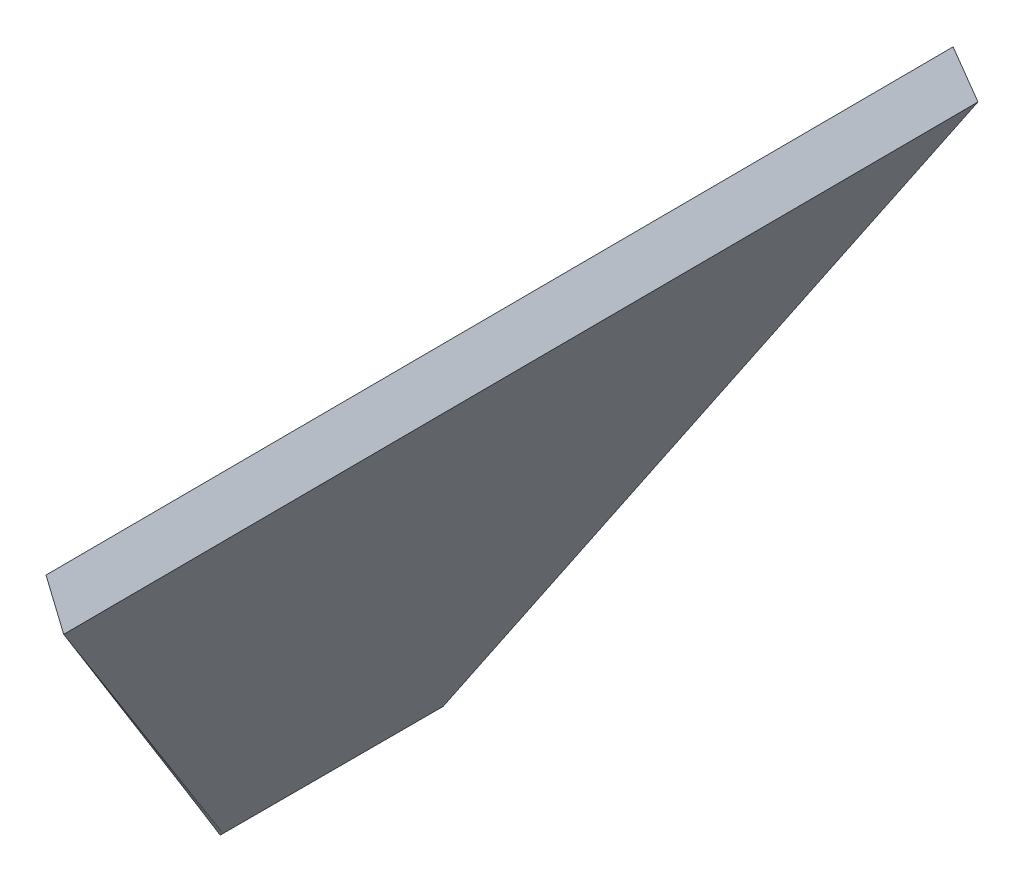
ISO-10303-21;
HEADER;
FILE_DESCRIPTION(('STEP AP214'),'2;1');
FILE_NAME('part.step','',(''),(''),'','','');
FILE_SCHEMA(('AUTOMOTIVE_DESIGN { 1 0 10303 214 1 1 1 1 }'));
ENDSEC;
DATA;
#1=APPLICATION_CONTEXT('core data for automotive mechanical design processes');
#2=APPLICATION_PROTOCOL_DEFINITION('international standard','automotive_design',2000,#1);
#3=PRODUCT_CONTEXT('',#1,'mechanical');
#4=PRODUCT('Part','Part','',(#3));
#5=PRODUCT_RELATED_PRODUCT_CATEGORY('part','',(#4));
#6=PRODUCT_DEFINITION_FORMATION('','',#4);
#7=PRODUCT_DEFINITION_CONTEXT('part definition',#1,'design');
#8=PRODUCT_DEFINITION('design','',#6,#7);
#9=PRODUCT_DEFINITION_SHAPE('','',#8);
#10=(LENGTH_UNIT() NAMED_UNIT(*) SI_UNIT(.MILLI.,.METRE.));
#11=(NAMED_UNIT(*) PLANE_ANGLE_UNIT() SI_UNIT($,.RADIAN.));
#12=(NAMED_UNIT(*) SI_UNIT($,.STERADIAN.) SOLID_ANGLE_UNIT());
#13=UNCERTAINTY_MEASURE_WITH_UNIT(LENGTH_MEASURE(1.E-05),#10,'distance_accuracy_value','');
#14=(GEOMETRIC_REPRESENTATION_CONTEXT(3) GLOBAL_UNCERTAINTY_ASSIGNED_CONTEXT((#13)) GLOBAL_UNIT_ASSIGNED_CONTEXT((#10,
#11,#12)) REPRESENTATION_CONTEXT('',''));
#15=CARTESIAN_POINT('',(0.,0.,0.));
#16=DIRECTION('',(0.,0.,1.));
#17=DIRECTION('',(1.,0.,0.));
#18=AXIS2_PLACEMENT_3D('',#15,#16,#17);
#19=CARTESIAN_POINT('',(-108.724229990897,312.439251428831,147.462223686257));
#20=DIRECTION('',(0.573127406974514,0.259388760360691,-0.777330332852909));
#21=DIRECTION('',(-0.804878930909419,0.,-0.593439050432403));
#22=AXIS2_PLACEMENT_3D('',#19,#20,#21);
#23=PLANE('',#22);
#24=CARTESIAN_POINT('',(85.6116867373077,31.4461867373069,196.981450827299));
#25=CARTESIAN_POINT('',(87.0719563259686,33.2839078969792,198.671343374664));
#26=CARTESIAN_POINT('',(88.5328622001463,35.1209118043416,200.361465715558));
#27=CARTESIAN_POINT('',(91.4557288766099,38.7937293281955,203.742091007913));
#28=CARTESIAN_POINT('',(92.9176896787831,40.6295429448143,205.432593959333));
#29=CARTESIAN_POINT('',(95.8424479246026,44.3002232939045,208.813900752339));
#30=CARTESIAN_POINT('',(97.3052453677012,46.1350900269941,210.504704593727));
#31=CARTESIAN_POINT('',(100.231529953867,49.8040444140138,213.886560821516));
#32=CARTESIAN_POINT('',(101.695017096956,51.6381320679197,215.577613207924));
#33=CARTESIAN_POINT('',(106.086327611059,57.1394344198961,220.651075851717));
#34=CARTESIAN_POINT('',(109.015000421497,60.805688953096,224.033792003557));
#35=CARTESIAN_POINT('',(114.873943308968,68.1363861130635,230.799797357173));
#36=CARTESIAN_POINT('',(117.804213384927,71.8008287410458,234.183086558564));
#37=CARTESIAN_POINT('',(123.665933443328,79.1283792537208,240.95008951616));
#38=CARTESIAN_POINT('',(126.597383425934,82.7914871382284,244.333803272425));
#39=CARTESIAN_POINT('',(132.461176734369,90.1166914411079,251.101551930969));
#40=CARTESIAN_POINT('',(135.393520060239,93.778787859434,254.485586833263));
#41=CARTESIAN_POINT('',(142.725229729155,102.933039680212,262.945971698112));
#42=CARTESIAN_POINT('',(147.125026928383,108.424706945342,268.022476444479));
#43=CARTESIAN_POINT('',(155.925714692369,119.406801670366,278.175878365238));
#44=CARTESIAN_POINT('',(160.326605257069,124.897229130325,283.25277553961));
#45=CARTESIAN_POINT('',(169.129192061475,135.877172760273,293.406859824358));
#46=CARTESIAN_POINT('',(173.530888301345,141.366688930079,298.484046934794));
#47=CARTESIAN_POINT('',(182.334890353051,152.345030193871,308.638639988116));
#48=CARTESIAN_POINT('',(186.737196164897,157.833855287847,313.716045931005));
#49=CARTESIAN_POINT('',(199.94481175737,174.299536078751,328.948513397212));
#50=CARTESIAN_POINT('',(208.750820827786,185.275598697528,339.10382586479));
#51=CARTESIAN_POINT('',(226.364012025771,207.226391286425,359.414871003695));
#52=CARTESIAN_POINT('',(235.171194153233,218.201121256666,369.570603674985));
#53=CARTESIAN_POINT('',(252.839482716995,240.215871186473,389.943614266309));
#54=CARTESIAN_POINT('',(261.700593981795,251.255885667907,400.160893918399));
#55=CARTESIAN_POINT('',(279.423385778047,273.33526871244,420.595657406512));
#56=CARTESIAN_POINT('',(288.285066309499,284.374637275539,430.813141242535));
#57=CARTESIAN_POINT('',(306.008843937193,306.45290479309,451.248259344183));
#58=CARTESIAN_POINT('',(314.870941033495,317.491803747474,461.465893609829));
#59=CARTESIAN_POINT('',(332.595454301163,339.569239542511,481.901276561503));
#60=CARTESIAN_POINT('',(341.457870472527,350.607776383164,492.119025247529));
#61=CARTESIAN_POINT('',(350.320398097041,361.646186737307,502.336813900701));
#62=B_SPLINE_CURVE_WITH_KNOTS('',3,(#24,#25,#26,#27,#28,#29,#30,#31,#32,#33,#34,#35,#36,#37,#38,
#39,#40,#41,#42,#43,#44,#45,#46,#47,#48,#49,#50,#51,#52,#53,#54,#55,#56,#57,#58,#59,#60,#61),
.UNSPECIFIED.,.F.,.F.,(4,2,2,2,2,2,2,2,2,2,2,2,2,2,2,2,2,2,4),(0.,8.67687040202061,
17.3537398763873,26.0306036781871,34.7074677489004,52.061193786794,69.4149081754379,
86.7686249700844,104.122342550636,130.15285758564,156.183371252471,182.213890169113,
208.244409457484,260.305441334685,312.366468448103,364.741521109206,417.116573785885,
469.49163411692,521.86669437124),.UNSPECIFIED.);
#63=CARTESIAN_POINT('',(85.6116867373077,31.4461867373069,196.981450827299));
#64=VERTEX_POINT('',#63);
#65=CARTESIAN_POINT('',(350.320400258716,361.646186737307,502.336811715639));
#66=VERTEX_POINT('',#65);
#67=EDGE_CURVE('E119',#64,#66,#62,.T.);
#68=ORIENTED_EDGE('',*,*,#67,.T.);
#69=CARTESIAN_POINT('',(341.615486236194,368.575782280536,498.231011991137));
#70=CARTESIAN_POINT('',(341.978192959735,368.287051688035,498.40208710989));
#71=CARTESIAN_POINT('',(342.340899431723,367.998320780169,498.57316222972));
#72=CARTESIAN_POINT('',(343.066311872591,367.420858333712,498.915312471534));
#73=CARTESIAN_POINT('',(343.429017841472,367.13212679512,499.086387593518));
#74=CARTESIAN_POINT('',(344.154429276127,366.554663087212,499.428537839641));
#75=CARTESIAN_POINT('',(344.517134741901,366.265930917895,499.599612963779));
#76=CARTESIAN_POINT('',(345.242545170342,365.68846594854,499.941763214211));
#77=CARTESIAN_POINT('',(345.605250133009,365.399733148501,500.112838340504));
#78=CARTESIAN_POINT('',(346.330659555237,364.822266917704,500.454988595244));
#79=CARTESIAN_POINT('',(346.693364014798,364.533533486944,500.626063723691));
#80=CARTESIAN_POINT('',(347.418772430813,363.956065994708,500.96821398274));
#81=CARTESIAN_POINT('',(347.781476387268,363.66733193323,501.139289113342));
#82=CARTESIAN_POINT('',(348.506883797071,363.089863179559,501.4814393767));
#83=CARTESIAN_POINT('',(348.869587250419,362.801128487365,501.652514509456));
#84=CARTESIAN_POINT('',(349.594993654011,362.223658472262,501.994664777122));
#85=CARTESIAN_POINT('',(349.957696604253,361.934923149353,502.165739912033));
#86=CARTESIAN_POINT('',(350.320399302943,361.646187511089,502.33681504802));
#87=B_SPLINE_CURVE_WITH_KNOTS('',3,(#69,#70,#71,#72,#73,#74,#75,#76,#77,#78,#79,#80,#81,#82,#83,
#84,#85,#86),.UNSPECIFIED.,.F.,.F.,(4,2,2,2,2,2,2,2,4),(0.,1.4824621301843,2.96492426036164,
4.44738639053315,5.92984852069981,7.41231065086241,8.89477278102214,10.3772349111797,
11.8596970413365),.UNSPECIFIED.);
#88=CARTESIAN_POINT('',(341.615486236194,368.575782280536,498.231011991137));
#89=VERTEX_POINT('',#88);
#90=EDGE_CURVE('E73',#89,#66,#87,.T.);
#91=ORIENTED_EDGE('',*,*,#90,.F.);
#92=CARTESIAN_POINT('',(76.9404436719945,38.395805428448,192.907154556921));
#93=CARTESIAN_POINT('',(81.7929076252006,44.4503462488485,198.50523781314));
#94=CARTESIAN_POINT('',(86.6454764812833,50.5047681623346,204.103358736224));
#95=CARTESIAN_POINT('',(96.3507613501414,62.6134451825814,215.299653419316));
#96=CARTESIAN_POINT('',(101.203477362917,68.6677002893421,220.897827179325));
#97=CARTESIAN_POINT('',(115.76175216307,86.8303219106648,237.692393969966));
#98=CARTESIAN_POINT('',(125.467437715139,98.9385447298398,248.888832514518));
#99=CARTESIAN_POINT('',(144.878968164247,123.154809728265,271.281766810967));
#100=CARTESIAN_POINT('',(154.584813061285,135.262851907516,282.478262562862));
#101=CARTESIAN_POINT('',(173.996592613353,159.478834517388,304.871286292739));
#102=CARTESIAN_POINT('',(183.702527268382,171.586774948009,316.06781427072));
#103=CARTESIAN_POINT('',(205.758970811549,199.10155764257,341.51153727214));
#104=CARTESIAN_POINT('',(218.109496460165,214.508380906464,355.758738312958));
#105=CARTESIAN_POINT('',(242.810599076981,245.321969258618,384.253158819907));
#106=CARTESIAN_POINT('',(255.161176045182,260.728734346878,398.500378286038));
#107=CARTESIAN_POINT('',(279.862362675744,291.542227461273,426.994828956451));
#108=CARTESIAN_POINT('',(292.212972338105,306.948955487408,441.242060160733));
#109=CARTESIAN_POINT('',(316.914214561464,337.762385578694,469.736530789546));
#110=CARTESIAN_POINT('',(329.264847122463,353.169087643845,483.983770214078));
#111=CARTESIAN_POINT('',(341.615486236194,368.575782280536,498.231011991138));
#112=B_SPLINE_CURVE_WITH_KNOTS('',3,(#92,#93,#94,#95,#96,#97,#98,#99,#100,#101,#102,#103,#104,
#105,#106,#107,#108,#109,#110,#111),.UNSPECIFIED.,.F.,.F.,(4,2,2,2,2,2,2,2,2,4),(0.,
28.7033388937463,57.4066777810984,114.813355538867,172.220033279852,229.626711025634,
302.674611881064,375.722512740872,448.770413603386,521.818314460314),.UNSPECIFIED.);
#113=CARTESIAN_POINT('',(76.9404436719944,38.3958054284489,192.907154560164));
#114=VERTEX_POINT('',#113);
#115=EDGE_CURVE('E63',#114,#89,#112,.T.);
#116=ORIENTED_EDGE('',*,*,#115,.F.);
#117=CARTESIAN_POINT('',(76.9404436712564,38.3958054281138,192.907154554615));
#118=CARTESIAN_POINT('',(78.1359029599248,37.4379951377876,193.468955941457));
#119=CARTESIAN_POINT('',(79.331319666552,36.4800959043862,194.030696252614));
#120=CARTESIAN_POINT('',(81.7220679398928,34.564119532064,195.154054734913));
#121=CARTESIAN_POINT('',(82.9173995066048,33.6060423931395,195.715672906054));
#122=CARTESIAN_POINT('',(84.1126884912738,32.6478763111364,196.277230001507));
#123=B_SPLINE_CURVE_WITH_KNOTS('',3,(#117,#118,#119,#120,#121,#122),.UNSPECIFIED.,.F.,.F.,(4,2,
4),(0.,4.89482359121515,9.78964728139703),.UNSPECIFIED.);
#124=CARTESIAN_POINT('',(84.1126884912739,32.6478763111362,196.277230001507));
#125=VERTEX_POINT('',#124);
#126=EDGE_CURVE('E82',#114,#125,#123,.T.);
#127=ORIENTED_EDGE('',*,*,#126,.T.);
#128=CARTESIAN_POINT('',(84.1126884912743,32.6478763111352,196.277230001507));
#129=CARTESIAN_POINT('',(84.376342631706,32.4346507474226,196.400471170861));
#130=CARTESIAN_POINT('',(84.6403379289291,32.222137991493,196.524201734));
#131=CARTESIAN_POINT('',(85.169010836958,31.7985380951999,196.772641647852));
#132=CARTESIAN_POINT('',(85.4336884477639,31.5874509548365,196.897350998563));
#133=CARTESIAN_POINT('',(85.6987072153611,31.3770766222561,197.02254974306));
#134=B_SPLINE_CURVE_WITH_KNOTS('',3,(#128,#129,#130,#131,#132,#133),.UNSPECIFIED.,.F.,.F.,(4,2,
4),(0.,1.0823492808665,2.16469856173302),.UNSPECIFIED.);
#135=EDGE_CURVE('E220',#125,#64,#134,.T.);
#136=ORIENTED_EDGE('',*,*,#135,.T.);
#137=EDGE_LOOP('',(#68,#91,#116,#127,#136));
#138=FACE_BOUND('',#137,.T.);
#139=ADVANCED_FACE('F38',(#138),#23,.F.);
#140=CARTESIAN_POINT('',(-43.7794599718674,348.054082561375,128.512156547839));
#141=DIRECTION('',(0.320862040401385,0.0996172698804472,-0.941872576610566));
#142=DIRECTION('',(-0.946581032931167,0.,-0.322466041770238));
#143=AXIS2_PLACEMENT_3D('',#140,#141,#142);
#144=PLANE('',#143);
#145=CARTESIAN_POINT('',(85.6116867373077,31.4461867373069,139.104983418644));
#146=CARTESIAN_POINT('',(88.4715866466048,35.0292534896405,140.458211742261));
#147=CARTESIAN_POINT('',(91.3316057950625,38.61221396637,141.81146944611));
#148=CARTESIAN_POINT('',(97.0518285389213,45.7779705100532,144.518030299414));
#149=CARTESIAN_POINT('',(99.9120321343222,49.360766577007,145.871333448868));
#150=CARTESIAN_POINT('',(108.492838540022,60.1089803705322,149.931291091531));
#151=CARTESIAN_POINT('',(114.213636982623,67.2742237058078,152.637993785096));
#152=CARTESIAN_POINT('',(125.655539326151,81.6044380135948,158.051474424388));
#153=CARTESIAN_POINT('',(131.376643227078,88.7694089861071,160.758252370115));
#154=CARTESIAN_POINT('',(142.8190486048,103.099174784011,166.171856938323));
#155=CARTESIAN_POINT('',(148.540350081595,110.263969609403,168.878683560805));
#156=CARTESIAN_POINT('',(165.704450080904,131.758179426781,176.999211578725));
#157=CARTESIAN_POINT('',(177.147444305051,146.08741992617,182.412961187425));
#158=CARTESIAN_POINT('',(200.03370041125,174.745662296352,193.240526347643));
#159=CARTESIAN_POINT('',(211.476962293304,189.074664167144,198.654341899161));
#160=CARTESIAN_POINT('',(243.983105583534,229.777670695805,214.032971883399));
#161=CARTESIAN_POINT('',(265.046172875821,256.151509601268,223.997832109311));
#162=CARTESIAN_POINT('',(296.640947449268,295.712113048316,238.945165215174));
#163=CARTESIAN_POINT('',(307.172567895398,308.898955023535,243.927616703339));
#164=CARTESIAN_POINT('',(328.235854203616,335.272598474247,253.892530867788));
#165=CARTESIAN_POINT('',(338.767520065704,348.459399949739,258.874993544074));
#166=CARTESIAN_POINT('',(349.299202399211,361.646186737307,263.857460278108));
#167=B_SPLINE_CURVE_WITH_KNOTS('',3,(#145,#146,#147,#148,#149,#150,#151,#152,#153,#154,#155,
#156,#157,#158,#159,#160,#161,#162,#163,#164,#165,#166),.UNSPECIFIED.,.F.,.F.,(4,2,2,2,2,2,2,2,
2,2,4),(0.,14.3400695735833,28.6801391322005,57.3602781852366,86.0404171547877,114.720556143849,
172.080833456703,229.441110856052,335.019402157811,387.808547633039,440.597693105904),.UNSPECIFIED.);
#168=CARTESIAN_POINT('',(85.6116867373077,31.4461867373068,139.104983418644));
#169=VERTEX_POINT('',#168);
#170=CARTESIAN_POINT('',(349.299202399211,361.646186737307,263.857460278109));
#171=VERTEX_POINT('',#170);
#172=EDGE_CURVE('E89',#169,#171,#167,.T.);
#173=ORIENTED_EDGE('',*,*,#172,.F.);
#174=CARTESIAN_POINT('',(76.9259541735794,38.3776877351288,136.879178443255));
#175=CARTESIAN_POINT('',(78.3736654056012,37.2225633050917,137.250189603792));
#176=CARTESIAN_POINT('',(79.8213320611685,36.067375995199,137.621178928241));
#177=CARTESIAN_POINT('',(81.9927651952136,34.334500738007,138.177630168924));
#178=CARTESIAN_POINT('',(82.7165651007031,33.7568599350014,138.363108458757));
#179=CARTESIAN_POINT('',(84.1641426300847,32.6015469036215,138.734054124179));
#180=CARTESIAN_POINT('',(84.8879202539767,32.0238746752471,138.919521499767));
#181=CARTESIAN_POINT('',(85.6116867373077,31.4461867373069,139.104983418644));
#182=B_SPLINE_CURVE_WITH_KNOTS('',3,(#174,#175,#176,#177,#178,#179,#180,#181),.UNSPECIFIED.,.F.,
.F.,(4,2,2,4),(0.,5.66660973040879,8.49991461408036,11.3332195028445),.UNSPECIFIED.);
#183=CARTESIAN_POINT('',(76.9259541736339,38.377687735146,136.879178466401));
#184=VERTEX_POINT('',#183);
#185=EDGE_CURVE('E105',#184,#169,#182,.T.);
#186=ORIENTED_EDGE('',*,*,#185,.F.);
#187=CARTESIAN_POINT('',(76.9259541736764,38.3776877351481,136.87917844329));
#188=CARTESIAN_POINT('',(79.7878837210808,41.9639059160794,138.233431502696));
#189=CARTESIAN_POINT('',(82.6499643790445,45.5499894343486,139.58772179741));
#190=CARTESIAN_POINT('',(88.3743594929247,52.7219480958637,142.296359994563));
#191=CARTESIAN_POINT('',(91.2366739488408,56.30782323911,143.650707897003));
#192=CARTESIAN_POINT('',(99.8238653725666,67.0652275239982,147.713812718641));
#193=CARTESIAN_POINT('',(105.548990416923,74.2365355465628,150.42263076189));
#194=CARTESIAN_POINT('',(116.999628039582,88.5788060570241,155.840362321721));
#195=CARTESIAN_POINT('',(122.725140617882,95.7497685449225,158.549275838301));
#196=CARTESIAN_POINT('',(134.176416531047,110.091469975375,163.967164651885));
#197=CARTESIAN_POINT('',(139.902179865912,117.262208917928,166.676139948888));
#198=CARTESIAN_POINT('',(157.079718114455,138.774203956893,174.803126950155));
#199=CARTESIAN_POINT('',(168.53174148518,153.115238531505,180.221199865499));
#200=CARTESIAN_POINT('',(191.436128188808,181.79700460929,191.057429454661));
#201=CARTESIAN_POINT('',(202.888491521712,196.137736112463,196.475586128478));
#202=CARTESIAN_POINT('',(235.38361536973,236.827761555284,211.849089239757));
#203=CARTESIAN_POINT('',(256.426610905254,263.176845931666,221.804493575716));
#204=CARTESIAN_POINT('',(287.99132444631,302.700275983461,236.737654322528));
#205=CARTESIAN_POINT('',(298.512932304713,315.874719879897,241.715383598581));
#206=CARTESIAN_POINT('',(319.556205639582,342.223556293254,251.670856344925));
#207=CARTESIAN_POINT('',(330.077871116048,355.397948810175,256.648599815216));
#208=CARTESIAN_POINT('',(340.599557495006,368.572322688092,261.626348434875));
#209=B_SPLINE_CURVE_WITH_KNOTS('',3,(#187,#188,#189,#190,#191,#192,#193,#194,#195,#196,#197,
#198,#199,#200,#201,#202,#203,#204,#205,#206,#207,#208),.UNSPECIFIED.,.F.,.F.,(4,2,2,2,2,2,2,2,
2,2,4),(0.,14.3516697941913,28.7033395643653,57.4066790015691,86.1100183044794,114.813357638734,
172.220035238932,229.626712978188,335.105278834038,387.844561478813,440.583844122906),.UNSPECIFIED.);
#210=CARTESIAN_POINT('',(340.599557495006,368.572322688092,261.626348434923));
#211=VERTEX_POINT('',#210);
#212=EDGE_CURVE('E113',#184,#211,#209,.T.);
#213=ORIENTED_EDGE('',*,*,#212,.T.);
#214=CARTESIAN_POINT('',(349.299202399211,361.646186737307,263.857460278108));
#215=CARTESIAN_POINT('',(348.574234041957,362.223367623438,263.671535295706));
#216=CARTESIAN_POINT('',(347.849265173027,362.80054778608,263.485610062474));
#217=CARTESIAN_POINT('',(346.036841721498,364.243496383954,263.020796352316));
#218=CARTESIAN_POINT('',(344.949386499302,365.109263914817,262.741907561851));
#219=CARTESIAN_POINT('',(342.77447375234,366.840795720787,262.184128852173));
#220=CARTESIAN_POINT('',(341.687016227574,367.706559995893,261.905238932959));
#221=CARTESIAN_POINT('',(340.599557551521,368.572322643098,261.626348449369));
#222=B_SPLINE_CURVE_WITH_KNOTS('',3,(#214,#215,#216,#217,#218,#219,#220,#221),.UNSPECIFIED.,.F.,
.F.,(4,2,2,4),(0.,2.83541265792917,7.08853164485781,11.3416506318234),.UNSPECIFIED.);
#223=EDGE_CURVE('E114',#171,#211,#222,.T.);
#224=ORIENTED_EDGE('',*,*,#223,.F.);
#225=EDGE_LOOP('',(#173,#186,#213,#224));
#226=FACE_BOUND('',#225,.T.);
#227=ADVANCED_FACE('F112',(#226),#144,.T.);
#228=CARTESIAN_POINT('',(85.7104778066998,31.3953036336931,224.84079999998));
#229=CARTESIAN_POINT('',(85.7066358554148,31.3878443702238,215.319611182266));
#230=CARTESIAN_POINT('',(85.7024328717195,31.3817222268896,205.798420188865));
#231=CARTESIAN_POINT('',(85.6983904559327,31.3766796815384,196.277230001507));
#232=CARTESIAN_POINT('',(85.6116867373077,31.4461867373069,224.84079999998));
#233=CARTESIAN_POINT('',(85.6116867373077,31.4461867373069,215.319610000489));
#234=CARTESIAN_POINT('',(85.6116867373077,31.4461867373069,205.798420000998));
#235=CARTESIAN_POINT('',(85.6116867373077,31.4461867373069,196.277230001507));
#236=CARTESIAN_POINT('',(75.7325797980967,36.5344970986776,224.84079999998));
#237=CARTESIAN_POINT('',(76.1167749265944,37.2804234456172,215.319491822811));
#238=CARTESIAN_POINT('',(76.5370732961312,37.8926377790306,205.798401214307));
#239=CARTESIAN_POINT('',(76.9413148748088,38.3968923141521,196.277230001507));
#240=B_SPLINE_SURFACE_WITH_KNOTS('',1,3,((#228,#229,#230,#231),(#232,#233,#234,#235),(#236,#237,
#238,#239)),.UNSPECIFIED.,.F.,.F.,.F.,(2,1,2),(4,4),(-0.01,0.,1.),(-0.0142817849992367,
0.0142817849992367),.UNSPECIFIED.);
#241=CARTESIAN_POINT('',(76.9413148748088,38.3968923141521,196.277230001507));
#242=CARTESIAN_POINT('',(85.6116867373077,31.4461867373069,196.277230001507));
#243=CARTESIAN_POINT('',(85.6983904559327,31.3766796815384,196.277230001507));
#244=B_SPLINE_CURVE_WITH_KNOTS('',1,(#241,#242,#243),.UNSPECIFIED.,.F.,.F.,(2,1,2),(-0.01,0.99,
1.),.UNSPECIFIED.);
#245=CARTESIAN_POINT('',(85.6116867373077,31.4461867373069,196.277230001507));
#246=VERTEX_POINT('',#245);
#247=EDGE_CURVE('E202',#125,#246,#244,.T.);
#248=CARTESIAN_POINT('',(85.6116867373077,31.4461867373069,224.84079999998));
#249=CARTESIAN_POINT('',(85.6116867373077,31.4461867373069,220.080205000235));
#250=CARTESIAN_POINT('',(85.6116867373077,31.4461867373069,215.319610000489));
#251=CARTESIAN_POINT('',(85.6116867373077,31.4461867373069,205.798420000998));
#252=CARTESIAN_POINT('',(85.6116867373077,31.4461867373069,201.037825001252));
#253=CARTESIAN_POINT('',(85.6116867373077,31.4461867373069,196.277230001507));
#254=B_SPLINE_CURVE_WITH_KNOTS('',3,(#248,#249,#250,#251,#252,#253),.UNSPECIFIED.,.F.,.F.,(4,2,
4),(0.,0.5,1.),.UNSPECIFIED.);
#255=EDGE_CURVE('E205',#64,#246,#254,.T.);
#256=ORIENTED_EDGE('',*,*,#135,.F.);
#257=ORIENTED_EDGE('',*,*,#247,.T.);
#258=ORIENTED_EDGE('',*,*,#255,.F.);
#259=EDGE_LOOP('',(#256,#257,#258));
#260=FACE_BOUND('',#259,.T.);
#261=ADVANCED_FACE('F175',(#260),#240,.T.);
#262=CARTESIAN_POINT('',(85.6116867373077,31.4461867373069,224.84079999998));
#263=CARTESIAN_POINT('',(255.683748074746,361.646186737307,597.997319736598));
#264=CARTESIAN_POINT('',(85.6116867373077,31.4461867373069,220.080205000235));
#265=CARTESIAN_POINT('',(271.456523438741,361.646186737307,582.053901733105));
#266=CARTESIAN_POINT('',(85.6116867373077,31.4461867373069,215.319610000489));
#267=CARTESIAN_POINT('',(287.229298802736,361.646186737307,566.110483729611));
#268=CARTESIAN_POINT('',(85.6116867373077,31.4461867373069,205.798420000998));
#269=CARTESIAN_POINT('',(318.774849530726,361.646186737307,534.223647722625));
#270=CARTESIAN_POINT('',(85.6116867373077,31.4461867373069,201.037825001252));
#271=CARTESIAN_POINT('',(334.547624894721,361.646186737307,518.280229719132));
#272=CARTESIAN_POINT('',(85.6116867373077,31.4461867373069,196.277230001507));
#273=CARTESIAN_POINT('',(350.320400258716,361.646186737307,502.336811715639));
#274=B_SPLINE_SURFACE_WITH_KNOTS('',3,1,((#262,#263),(#264,#265),(#266,#267),(#268,#269),(#270,
#271),(#272,#273)),.UNSPECIFIED.,.F.,.F.,.F.,(4,2,4),(2,2),(0.,0.5,1.),(0.,1.),.UNSPECIFIED.);
#275=DIRECTION('',(0.506834054283152,0.632229300267297,0.586007980579127));
#276=VECTOR('',#275,1.);
#277=CARTESIAN_POINT('',(217.966043498012,196.546186737307,349.307020858573));
#278=LINE('',#277,#276);
#279=EDGE_CURVE('E109',#246,#66,#278,.T.);
#280=ORIENTED_EDGE('',*,*,#67,.F.);
#281=ORIENTED_EDGE('',*,*,#255,.T.);
#282=ORIENTED_EDGE('',*,*,#279,.T.);
#283=EDGE_LOOP('',(#280,#281,#282));
#284=FACE_BOUND('',#283,.T.);
#285=ADVANCED_FACE('F144',(#284),#274,.T.);
#286=CARTESIAN_POINT('',(348.335582062564,361.646186737307,38.8241322344509));
#287=CARTESIAN_POINT('',(348.342197468227,361.646186737307,40.369021540051));
#288=CARTESIAN_POINT('',(348.34881287389,361.646186737307,41.9139108456511));
#289=CARTESIAN_POINT('',(348.355428279554,361.646186737307,43.4588001512512));
#290=CARTESIAN_POINT('',(349.010418939274,361.646186737307,196.41813733938));
#291=CARTESIAN_POINT('',(349.665409598995,361.646186737307,349.37747452751));
#292=CARTESIAN_POINT('',(350.320400258716,361.646186737307,502.336811715639));
#293=CARTESIAN_POINT('',(350.326950165314,361.646186737307,503.866405087521));
#294=CARTESIAN_POINT('',(350.333500071911,361.646186737307,505.395998459402));
#295=CARTESIAN_POINT('',(350.340049978508,361.646186737307,506.925591831283));
#296=CARTESIAN_POINT('',(339.643052932137,368.569062444801,38.861354711316));
#297=CARTESIAN_POINT('',(339.649686352475,368.569085064513,40.406243939775));
#298=CARTESIAN_POINT('',(339.656319772814,368.569107684224,41.9511331682341));
#299=CARTESIAN_POINT('',(339.662953193152,368.569130303936,43.4960223966931));
#300=CARTESIAN_POINT('',(340.319727484085,368.571369879345,196.455351947095));
#301=CARTESIAN_POINT('',(340.976501542562,368.573607386804,349.414681498492));
#302=CARTESIAN_POINT('',(341.633275365821,368.575842829401,502.374011050896));
#303=CARTESIAN_POINT('',(341.639843104054,368.575865183827,503.90360434642));
#304=CARTESIAN_POINT('',(341.646410842286,368.575887538253,505.433197641944));
#305=CARTESIAN_POINT('',(341.652978580519,368.575909892679,506.962790937468));
#306=B_SPLINE_SURFACE_WITH_KNOTS('',1,3,((#286,#287,#288,#289,#290,#291,#292,#293,#294,#295),
(#296,#297,#298,#299,#300,#301,#302,#303,#304,#305)),.UNSPECIFIED.,.F.,.F.,.F.,(2,2),(4,3,3,4),
(0.,1.),(-0.234075819743937,-0.229441109335362,0.229441109335361,0.234029931522068),.UNSPECIFIED.);
#307=CARTESIAN_POINT('',(348.355428279554,361.646186737307,43.4588001512512));
#308=CARTESIAN_POINT('',(348.682923609414,361.646186737307,119.938468745316));
#309=CARTESIAN_POINT('',(349.010418939275,361.646186737307,196.418137339381));
#310=CARTESIAN_POINT('',(349.665409598995,361.646186737307,349.377474527511));
#311=CARTESIAN_POINT('',(349.992904928856,361.646186737307,425.857143121575));
#312=CARTESIAN_POINT('',(350.320400258716,361.646186737307,502.336811715639));
#313=B_SPLINE_CURVE_WITH_KNOTS('',3,(#307,#308,#309,#310,#311,#312),.UNSPECIFIED.,.F.,.F.,(4,2,
4),(0.,0.5,1.),.UNSPECIFIED.);
#314=EDGE_CURVE('E285',#171,#66,#313,.T.);
#315=CARTESIAN_POINT('',(339.643052932137,368.569062444801,38.861354711316));
#316=CARTESIAN_POINT('',(339.649686352475,368.569085064513,40.406243939775));
#317=CARTESIAN_POINT('',(339.656319772814,368.569107684224,41.9511331682341));
#318=CARTESIAN_POINT('',(339.662953193152,368.569130303936,43.4960223966931));
#319=CARTESIAN_POINT('',(340.319727484085,368.571369879345,196.455351947095));
#320=CARTESIAN_POINT('',(340.976501542562,368.573607386804,349.414681498492));
#321=CARTESIAN_POINT('',(341.633275365821,368.575842829401,502.374011050896));
#322=CARTESIAN_POINT('',(341.639843104054,368.575865183827,503.90360434642));
#323=CARTESIAN_POINT('',(341.646410842286,368.575887538253,505.433197641944));
#324=CARTESIAN_POINT('',(341.652978580519,368.575909892679,506.962790937468));
#325=B_SPLINE_CURVE_WITH_KNOTS('',3,(#315,#316,#317,#318,#319,#320,#321,#322,#323,#324),
.UNSPECIFIED.,.F.,.F.,(4,3,3,4),(-0.234075819743937,-0.229441109335362,0.229441109335361,
0.234029931522068),.UNSPECIFIED.);
#326=EDGE_CURVE('E11',#211,#89,#325,.T.);
#327=ORIENTED_EDGE('',*,*,#314,.F.);
#328=ORIENTED_EDGE('',*,*,#223,.T.);
#329=ORIENTED_EDGE('',*,*,#326,.T.);
#330=ORIENTED_EDGE('',*,*,#90,.T.);
#331=EDGE_LOOP('',(#327,#328,#329,#330));
#332=FACE_BOUND('',#331,.T.);
#333=ADVANCED_FACE('F234',(#332),#306,.T.);
#334=CARTESIAN_POINT('',(85.6116867373077,31.4461867373069,196.277230001507));
#335=CARTESIAN_POINT('',(85.6116867373077,31.4461867373069,163.808233537469));
#336=CARTESIAN_POINT('',(85.6116867373077,31.4461867373069,131.339237073432));
#337=CARTESIAN_POINT('',(85.6116867373077,31.4461867373069,98.8702406093947));
#338=CARTESIAN_POINT('',(76.9413148748088,38.3968923141521,196.277230001507));
#339=CARTESIAN_POINT('',(76.9329214572068,38.3864222904974,163.808233537469));
#340=CARTESIAN_POINT('',(76.9245226279307,38.3759066566038,131.339237073432));
#341=CARTESIAN_POINT('',(76.9161186737156,38.365345089407,98.8702406093947));
#342=B_SPLINE_SURFACE_WITH_KNOTS('',1,3,((#334,#335,#336,#337),(#338,#339,#340,#341)),
.UNSPECIFIED.,.F.,.F.,.F.,(2,2),(4,4),(0.,1.),(-0.048703494696056,0.0487034946960561),.UNSPECIFIED.);
#343=CARTESIAN_POINT('',(76.9413148748088,38.3968923141521,196.277230001507));
#344=CARTESIAN_POINT('',(76.9329214572068,38.3864222904974,163.808233537469));
#345=CARTESIAN_POINT('',(76.9245226279307,38.3759066566038,131.339237073432));
#346=CARTESIAN_POINT('',(76.9161186737156,38.365345089407,98.8702406093947));
#347=B_SPLINE_CURVE_WITH_KNOTS('',3,(#343,#344,#345,#346),.UNSPECIFIED.,.F.,.F.,(4,4),
(-0.048703494696056,0.0487034946960561),.UNSPECIFIED.);
#348=EDGE_CURVE('E56',#114,#184,#347,.T.);
#349=CARTESIAN_POINT('',(85.6116867373077,31.4461867373069,196.277230001507));
#350=CARTESIAN_POINT('',(85.6116867373077,31.4461867373069,180.042731769488));
#351=CARTESIAN_POINT('',(85.6116867373077,31.4461867373069,163.808233537469));
#352=CARTESIAN_POINT('',(85.6116867373077,31.4461867373069,131.339237073432));
#353=CARTESIAN_POINT('',(85.6116867373077,31.4461867373069,115.104738841413));
#354=CARTESIAN_POINT('',(85.6116867373077,31.4461867373069,98.8702406093947));
#355=B_SPLINE_CURVE_WITH_KNOTS('',3,(#349,#350,#351,#352,#353,#354),.UNSPECIFIED.,.F.,.F.,(4,2,
4),(0.,0.5,1.),.UNSPECIFIED.);
#356=EDGE_CURVE('E266',#246,#169,#355,.T.);
#357=ORIENTED_EDGE('',*,*,#348,.T.);
#358=ORIENTED_EDGE('',*,*,#185,.T.);
#359=ORIENTED_EDGE('',*,*,#356,.F.);
#360=ORIENTED_EDGE('',*,*,#247,.F.);
#361=ORIENTED_EDGE('',*,*,#126,.F.);
#362=EDGE_LOOP('',(#357,#358,#359,#360,#361));
#363=FACE_BOUND('',#362,.T.);
#364=ADVANCED_FACE('F103',(#363),#342,.T.);
#365=CARTESIAN_POINT('',(85.6116867373077,31.4461867373069,196.277230001507));
#366=CARTESIAN_POINT('',(350.320400258716,361.646186737307,502.336811715639));
#367=CARTESIAN_POINT('',(85.6116867373077,31.4461867373069,180.042731769488));
#368=CARTESIAN_POINT('',(349.992904928856,361.646186737307,425.857143121575));
#369=CARTESIAN_POINT('',(85.6116867373077,31.4461867373069,163.808233537469));
#370=CARTESIAN_POINT('',(349.665409598995,361.646186737307,349.377474527511));
#371=CARTESIAN_POINT('',(85.6116867373077,31.4461867373069,131.339237073432));
#372=CARTESIAN_POINT('',(349.010418939275,361.646186737307,196.418137339381));
#373=CARTESIAN_POINT('',(85.6116867373077,31.4461867373069,115.104738841413));
#374=CARTESIAN_POINT('',(348.682923609414,361.646186737307,119.938468745316));
#375=CARTESIAN_POINT('',(85.6116867373077,31.4461867373069,98.8702406093947));
#376=CARTESIAN_POINT('',(348.355428279554,361.646186737307,43.4588001512512));
#377=B_SPLINE_SURFACE_WITH_KNOTS('',3,1,((#365,#366),(#367,#368),(#369,#370),(#371,#372),(#373,
#374),(#375,#376)),.UNSPECIFIED.,.F.,.F.,.F.,(4,2,4),(2,2),(0.,0.5,1.),(0.,1.),.UNSPECIFIED.);
#378=OFFSET_SURFACE('',#377,-11.1125,.F.);
#379=ORIENTED_EDGE('',*,*,#212,.F.);
#380=ORIENTED_EDGE('',*,*,#348,.F.);
#381=ORIENTED_EDGE('',*,*,#115,.T.);
#382=ORIENTED_EDGE('',*,*,#326,.F.);
#383=EDGE_LOOP('',(#379,#380,#381,#382));
#384=FACE_BOUND('',#383,.T.);
#385=ADVANCED_FACE('F116',(#384),#378,.F.);
#386=CARTESIAN_POINT('',(85.6116867373077,31.4461867373069,196.277230001507));
#387=CARTESIAN_POINT('',(350.320400258716,361.646186737307,502.336811715639));
#388=CARTESIAN_POINT('',(85.6116867373077,31.4461867373069,180.042731769488));
#389=CARTESIAN_POINT('',(349.992904928856,361.646186737307,425.857143121575));
#390=CARTESIAN_POINT('',(85.6116867373077,31.4461867373069,163.808233537469));
#391=CARTESIAN_POINT('',(349.665409598995,361.646186737307,349.377474527511));
#392=CARTESIAN_POINT('',(85.6116867373077,31.4461867373069,131.339237073432));
#393=CARTESIAN_POINT('',(349.010418939275,361.646186737307,196.418137339381));
#394=CARTESIAN_POINT('',(85.6116867373077,31.4461867373069,115.104738841413));
#395=CARTESIAN_POINT('',(348.682923609414,361.646186737307,119.938468745316));
#396=CARTESIAN_POINT('',(85.6116867373077,31.4461867373069,98.8702406093947));
#397=CARTESIAN_POINT('',(348.355428279554,361.646186737307,43.4588001512512));
#398=B_SPLINE_SURFACE_WITH_KNOTS('',3,1,((#386,#387),(#388,#389),(#390,#391),(#392,#393),(#394,
#395),(#396,#397)),.UNSPECIFIED.,.F.,.F.,.F.,(4,2,4),(2,2),(0.,0.5,1.),(0.,1.),.UNSPECIFIED.);
#399=ORIENTED_EDGE('',*,*,#356,.T.);
#400=ORIENTED_EDGE('',*,*,#172,.T.);
#401=ORIENTED_EDGE('',*,*,#314,.T.);
#402=ORIENTED_EDGE('',*,*,#279,.F.);
#403=EDGE_LOOP('',(#399,#400,#401,#402));
#404=FACE_BOUND('',#403,.T.);
#405=ADVANCED_FACE('F40',(#404),#398,.T.);
#406=CLOSED_SHELL('',(#139,#227,#261,#285,#333,#364,#385,#405));
#407=MANIFOLD_SOLID_BREP('B2',#406);
#408=ADVANCED_BREP_SHAPE_REPRESENTATION('',(#18,#407),#14);
#409=SHAPE_DEFINITION_REPRESENTATION(#9,#408);
ENDSEC;
END-ISO-10303-21;
